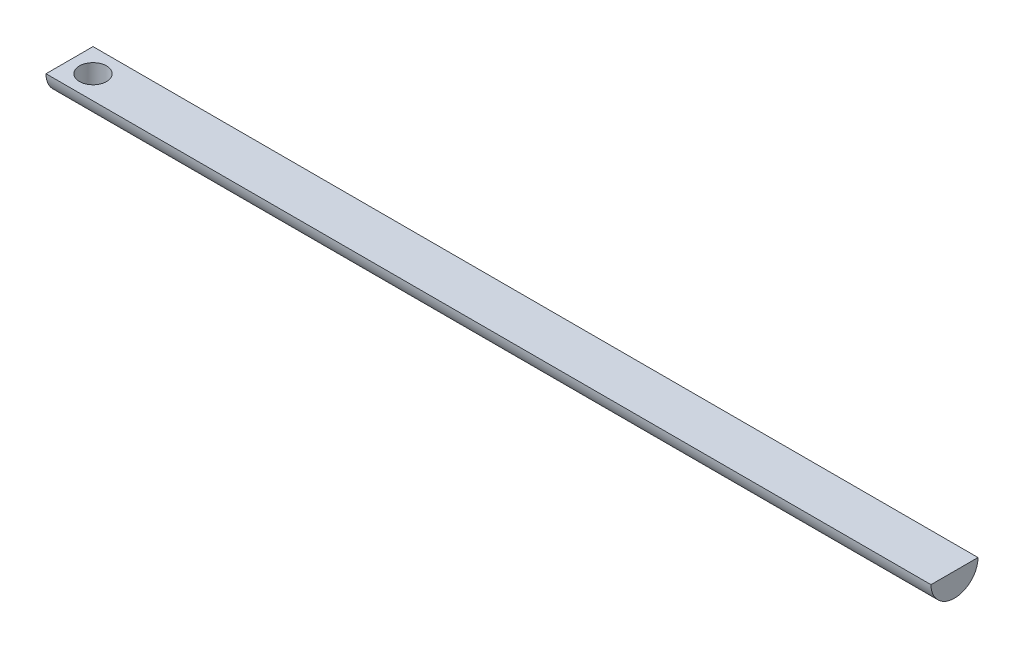
ISO-10303-21;
HEADER;
FILE_DESCRIPTION(('STEP AP214'),'2;1');
FILE_NAME('part.step','',(''),(''),'','','');
FILE_SCHEMA(('AUTOMOTIVE_DESIGN { 1 0 10303 214 1 1 1 1 }'));
ENDSEC;
DATA;
#1=APPLICATION_CONTEXT('core data for automotive mechanical design processes');
#2=APPLICATION_PROTOCOL_DEFINITION('international standard','automotive_design',2000,#1);
#3=PRODUCT_CONTEXT('',#1,'mechanical');
#4=PRODUCT('Part','Part','',(#3));
#5=PRODUCT_RELATED_PRODUCT_CATEGORY('part','',(#4));
#6=PRODUCT_DEFINITION_FORMATION('','',#4);
#7=PRODUCT_DEFINITION_CONTEXT('part definition',#1,'design');
#8=PRODUCT_DEFINITION('design','',#6,#7);
#9=PRODUCT_DEFINITION_SHAPE('','',#8);
#10=(LENGTH_UNIT() NAMED_UNIT(*) SI_UNIT(.MILLI.,.METRE.));
#11=(NAMED_UNIT(*) PLANE_ANGLE_UNIT() SI_UNIT($,.RADIAN.));
#12=(NAMED_UNIT(*) SI_UNIT($,.STERADIAN.) SOLID_ANGLE_UNIT());
#13=UNCERTAINTY_MEASURE_WITH_UNIT(LENGTH_MEASURE(1.E-05),#10,'distance_accuracy_value','');
#14=(GEOMETRIC_REPRESENTATION_CONTEXT(3) GLOBAL_UNCERTAINTY_ASSIGNED_CONTEXT((#13)) GLOBAL_UNIT_ASSIGNED_CONTEXT((#10,
#11,#12)) REPRESENTATION_CONTEXT('',''));
#15=CARTESIAN_POINT('',(0.,0.,0.));
#16=DIRECTION('',(0.,0.,1.));
#17=DIRECTION('',(1.,0.,0.));
#18=AXIS2_PLACEMENT_3D('',#15,#16,#17);
#19=CARTESIAN_POINT('',(-19.238381132,0.,0.));
#20=DIRECTION('',(1.,0.,0.));
#21=DIRECTION('',(0.,0.,-1.));
#22=AXIS2_PLACEMENT_3D('',#19,#20,#21);
#23=CYLINDRICAL_SURFACE('',#22,4.7625);
#24=CARTESIAN_POINT('',(-14.475881132,-3.88830377542702,2.74999999999999));
#25=CARTESIAN_POINT('',(-14.6154852221818,-3.88830587930621,2.74999883491765));
#26=CARTESIAN_POINT('',(-14.7550981181335,-3.89593553817568,2.73930328145687));
#27=CARTESIAN_POINT('',(-15.0297115035431,-3.92516366481732,2.69724269783794));
#28=CARTESIAN_POINT('',(-15.1647070213616,-3.94677671942619,2.66585608306648));
#29=CARTESIAN_POINT('',(-15.4255726669989,-4.00057279944975,2.58440687577187));
#30=CARTESIAN_POINT('',(-15.5514968357306,-4.03268557392372,2.53446811641262));
#31=CARTESIAN_POINT('',(-15.7931222615094,-4.10373801422,2.41772697161589));
#32=CARTESIAN_POINT('',(-15.9088202124561,-4.14267987580842,2.35091915919961));
#33=CARTESIAN_POINT('',(-16.1409812303454,-4.22830198118876,2.19356917077883));
#34=CARTESIAN_POINT('',(-16.2560705852671,-4.27536011683003,2.10120397361381));
#35=CARTESIAN_POINT('',(-16.4702385259634,-4.36887662962746,1.89914552907905));
#36=CARTESIAN_POINT('',(-16.5693063670097,-4.41533458522114,1.78944074972566));
#37=CARTESIAN_POINT('',(-16.7582082713967,-4.50782478633834,1.54267346427661));
#38=CARTESIAN_POINT('',(-16.8461999823735,-4.55337378606475,1.40398639918465));
#39=CARTESIAN_POINT('',(-16.9592221605744,-4.6135550954253,1.18420123561663));
#40=CARTESIAN_POINT('',(-16.9937434034422,-4.63226322507906,1.10895422091026));
#41=CARTESIAN_POINT('',(-17.0560544367173,-4.66642441041304,0.955030585725459));
#42=CARTESIAN_POINT('',(-17.0838485093342,-4.68187953598587,0.876356184805018));
#43=CARTESIAN_POINT('',(-17.1301287006608,-4.70782373993134,0.723377898041835));
#44=CARTESIAN_POINT('',(-17.1492248504899,-4.71863328044411,0.649312172313138));
#45=CARTESIAN_POINT('',(-17.1812250624901,-4.73683634436756,0.499478138293475));
#46=CARTESIAN_POINT('',(-17.1941324701455,-4.74423171331641,0.423710773110705));
#47=CARTESIAN_POINT('',(-17.2135625125591,-4.7553907443262,0.271126024753998));
#48=CARTESIAN_POINT('',(-17.220088140592,-4.75915610897265,0.194309150995613));
#49=CARTESIAN_POINT('',(-17.2266666973281,-4.76295334149383,0.0403323004068748));
#50=CARTESIAN_POINT('',(-17.2267202145561,-4.76298554883365,-0.0368276445890793));
#51=CARTESIAN_POINT('',(-17.2178726372451,-4.75787491203964,-0.249998217036768));
#52=CARTESIAN_POINT('',(-17.2020646344675,-4.74873967198016,-0.385707258622333));
#53=CARTESIAN_POINT('',(-17.1509038451293,-4.7195576187624,-0.652065078438339));
#54=CARTESIAN_POINT('',(-17.1155496183596,-4.69951000155756,-0.782713483030643));
#55=CARTESIAN_POINT('',(-17.0264837690719,-4.65006428065995,-1.03692573802871));
#56=CARTESIAN_POINT('',(-16.9726224156077,-4.62059005044247,-1.16042189033012));
#57=CARTESIAN_POINT('',(-16.8484883110455,-4.55471263964845,-1.39681207693103));
#58=CARTESIAN_POINT('',(-16.7782108377461,-4.51830746590027,-1.50970304745582));
#59=CARTESIAN_POINT('',(-16.6141301339464,-4.43681969268294,-1.73552260390604));
#60=CARTESIAN_POINT('',(-16.5185549721156,-4.3912208279119,-1.84697690002465));
#61=CARTESIAN_POINT('',(-16.3111881147554,-4.29867907131808,-2.05318525118317));
#62=CARTESIAN_POINT('',(-16.1993762627988,-4.25173456800803,-2.14791821947782));
#63=CARTESIAN_POINT('',(-15.9489792252352,-4.15622004509959,-2.32779633395073));
#64=CARTESIAN_POINT('',(-15.8088226608791,-4.10798049681462,-2.41094939984701));
#65=CARTESIAN_POINT('',(-15.5134574240803,-4.02190136968189,-2.55197772374603));
#66=CARTESIAN_POINT('',(-15.3582763380942,-3.9840432018418,-2.60989827429046));
#67=CARTESIAN_POINT('',(-15.0744587543764,-3.93224111198343,-2.68710233091371));
#68=CARTESIAN_POINT('',(-14.9480557095074,-3.91478131505084,-2.7122422187777));
#69=CARTESIAN_POINT('',(-14.6919326437156,-3.89222067204206,-2.7445283395405));
#70=CARTESIAN_POINT('',(-14.5622160675986,-3.88710747954931,-2.75169254812574));
#71=CARTESIAN_POINT('',(-14.3031354014722,-3.88998013731096,-2.74762860941465));
#72=CARTESIAN_POINT('',(-14.1737716427324,-3.89797566913988,-2.73638686823525));
#73=CARTESIAN_POINT('',(-13.9191427201924,-3.92591368648854,-2.69614295857265));
#74=CARTESIAN_POINT('',(-13.7938806721784,-3.94586504171942,-2.66712760395747));
#75=CARTESIAN_POINT('',(-13.5491480736175,-3.99539722331328,-2.592337995176));
#76=CARTESIAN_POINT('',(-13.4297474625128,-4.02507179046594,-2.54640003293607));
#77=CARTESIAN_POINT('',(-13.1998911766549,-4.09083130922471,-2.43935386081035));
#78=CARTESIAN_POINT('',(-13.089439117637,-4.12691883341612,-2.37823955894608));
#79=CARTESIAN_POINT('',(-12.8608166880978,-4.20881052895718,-2.23060065383238));
#80=CARTESIAN_POINT('',(-12.7445071491199,-4.25522522604444,-2.14152550302251));
#81=CARTESIAN_POINT('',(-12.5273814426932,-4.34809362555827,-1.94608135483644));
#82=CARTESIAN_POINT('',(-12.4265786961404,-4.39454732717359,-1.83969753908343));
#83=CARTESIAN_POINT('',(-12.2326232341287,-4.48811131263387,-1.59892892533195));
#84=CARTESIAN_POINT('',(-12.1414085035419,-4.5347709939573,-1.46277239593626));
#85=CARTESIAN_POINT('',(-12.0231767182355,-4.59712540728279,-1.24640402136017));
#86=CARTESIAN_POINT('',(-11.9868552099948,-4.61664309589095,-1.17223134459331));
#87=CARTESIAN_POINT('',(-11.9208199500919,-4.65257692081205,-1.02029808614337));
#88=CARTESIAN_POINT('',(-11.8911020743726,-4.66899499190861,-0.942539780584442));
#89=CARTESIAN_POINT('',(-11.8407793366156,-4.6970488835675,-0.790344366637079));
#90=CARTESIAN_POINT('',(-11.8196375341274,-4.7089612654446,-0.716135253136256));
#91=CARTESIAN_POINT('',(-11.7836049808688,-4.72938014106823,-0.565791615885945));
#92=CARTESIAN_POINT('',(-11.7687108391042,-4.73788848228332,-0.489658160451029));
#93=CARTESIAN_POINT('',(-11.7453969775974,-4.75124798516582,-0.336122755159983));
#94=CARTESIAN_POINT('',(-11.7369738368962,-4.75610107918935,-0.258721497675619));
#95=CARTESIAN_POINT('',(-11.7267202185895,-4.76201415757879,-0.103365973151112));
#96=CARTESIAN_POINT('',(-11.7248890573859,-4.76307453525489,-0.0254117642929458));
#97=CARTESIAN_POINT('',(-11.7290074139458,-4.76069188609969,0.189466487735567));
#98=CARTESIAN_POINT('',(-11.7419076220403,-4.75322555124408,0.326295404143724));
#99=CARTESIAN_POINT('',(-11.7876286698824,-4.72707821467467,0.595369129229569));
#100=CARTESIAN_POINT('',(-11.8204504110033,-4.70839670551758,0.727613730198305));
#101=CARTESIAN_POINT('',(-11.9044384126064,-4.66154624791974,0.984050398516189));
#102=CARTESIAN_POINT('',(-11.9555726515451,-4.63339386558524,1.10825607800419));
#103=CARTESIAN_POINT('',(-12.0743586998122,-4.56986884587246,1.34644970472317));
#104=CARTESIAN_POINT('',(-12.142014833413,-4.5344943186416,1.46043496627067));
#105=CARTESIAN_POINT('',(-12.3003213375925,-4.4549715024455,1.6884197508144));
#106=CARTESIAN_POINT('',(-12.392681917932,-4.410286194789,1.80104321758976));
#107=CARTESIAN_POINT('',(-12.5935794383751,-4.31902205245674,2.01009868725515));
#108=CARTESIAN_POINT('',(-12.7021355964385,-4.27244101668878,2.10651116080856));
#109=CARTESIAN_POINT('',(-12.9464110680375,-4.17662509357829,2.29110411776497));
#110=CARTESIAN_POINT('',(-13.0838029893327,-4.12765781140798,2.37722841876759));
#111=CARTESIAN_POINT('',(-13.3739704910884,-4.03907989072813,2.52481403197027));
#112=CARTESIAN_POINT('',(-13.5267235007934,-3.99945580229541,2.58631088665692));
#113=CARTESIAN_POINT('',(-13.8118973779203,-3.94263859757724,2.67190995943804));
#114=CARTESIAN_POINT('',(-13.9422197990667,-3.92253552622089,2.70104822057837));
#115=CARTESIAN_POINT('',(-14.2069890289663,-3.89537448036743,2.74008291836056));
#116=CARTESIAN_POINT('',(-14.3414309966919,-3.88830174921961,2.7500011220694));
#117=CARTESIAN_POINT('',(-14.475881132,-3.88830377542702,2.74999999999999));
#118=B_SPLINE_CURVE_WITH_KNOTS('',3,(#24,#25,#26,#27,#28,#29,#30,#31,#32,#33,#34,#35,#36,#37,
#38,#39,#40,#41,#42,#43,#44,#45,#46,#47,#48,#49,#50,#51,#52,#53,#54,#55,#56,#57,#58,#59,#60,#61,
#62,#63,#64,#65,#66,#67,#68,#69,#70,#71,#72,#73,#74,#75,#76,#77,#78,#79,#80,#81,#82,#83,#84,#85,
#86,#87,#88,#89,#90,#91,#92,#93,#94,#95,#96,#97,#98,#99,#100,#101,#102,#103,#104,#105,#106,#107,
#108,#109,#110,#111,#112,#113,#114,#115,#116,#117),.UNSPECIFIED.,.T.,.F.,(4,2,2,2,2,2,2,2,2,2,2,
2,2,2,2,2,2,2,2,2,2,2,2,2,2,2,2,2,2,2,2,2,2,2,2,2,2,2,2,2,2,2,2,2,2,2,4),(0.,0.418249565803552,
0.836936135352352,1.25287682136757,1.66895149141453,2.13176015789124,2.59487792841622,
3.10315447239935,3.35745703679342,3.61159729551518,3.84301505571462,4.07430757562723,
4.30549155926143,4.53665452075717,4.94530460916895,5.35398481184235,5.76605246339868,
6.17823879512822,6.63759758991315,7.09753159222605,7.60483109270739,8.11121619685135,
8.49968312922574,8.88776143941098,9.27612649770404,9.6647800311379,10.0572965749503,
10.4499709353828,10.9091476918833,11.3687196497721,11.876918474382,12.1311929929367,
12.3853082645447,12.6192051339033,12.8529748880897,13.0866209723657,13.3202428265009,
13.7309681121824,14.1417119829965,14.5517410992021,14.9618776474886,15.4171030794834,
15.872873050902,16.3785307259256,16.8834559796423,17.2867214279916,17.6895299033135),.UNSPECIFIED.);
#119=CARTESIAN_POINT('',(-14.475881132,-3.88830377542702,2.74999999999999));
#120=VERTEX_POINT('',#119);
#121=EDGE_CURVE('E42',#120,#120,#118,.T.);
#122=ORIENTED_EDGE('',*,*,#121,.F.);
#123=EDGE_LOOP('',(#122));
#124=FACE_BOUND('',#123,.T.);
#125=DIRECTION('',(1.,0.,0.));
#126=VECTOR('',#125,1.);
#127=CARTESIAN_POINT('',(-19.238381132,0.,-4.7625));
#128=LINE('',#127,#126);
#129=CARTESIAN_POINT('',(-19.238381132,0.,-4.7625));
#130=VERTEX_POINT('',#129);
#131=CARTESIAN_POINT('',(160.,0.,-4.7625));
#132=VERTEX_POINT('',#131);
#133=EDGE_CURVE('E51',#130,#132,#128,.T.);
#134=ORIENTED_EDGE('',*,*,#133,.T.);
#135=CARTESIAN_POINT('',(160.,0.,0.));
#136=DIRECTION('',(1.,0.,0.));
#137=DIRECTION('',(0.,0.,-1.));
#138=AXIS2_PLACEMENT_3D('',#135,#136,#137);
#139=CIRCLE('',#138,4.7625);
#140=CARTESIAN_POINT('',(160.,0.,4.7625));
#141=VERTEX_POINT('',#140);
#142=EDGE_CURVE('E69',#141,#132,#139,.T.);
#143=ORIENTED_EDGE('',*,*,#142,.F.);
#144=DIRECTION('',(1.,0.,0.));
#145=VECTOR('',#144,1.);
#146=CARTESIAN_POINT('',(-19.238381132,0.,4.7625));
#147=LINE('',#146,#145);
#148=CARTESIAN_POINT('',(-19.238381132,0.,4.7625));
#149=VERTEX_POINT('',#148);
#150=EDGE_CURVE('E11',#149,#141,#147,.T.);
#151=ORIENTED_EDGE('',*,*,#150,.F.);
#152=CARTESIAN_POINT('',(-19.238381132,0.,0.));
#153=DIRECTION('',(1.,0.,0.));
#154=DIRECTION('',(0.,0.,-1.));
#155=AXIS2_PLACEMENT_3D('',#152,#153,#154);
#156=CIRCLE('',#155,4.7625);
#157=EDGE_CURVE('E70',#149,#130,#156,.T.);
#158=ORIENTED_EDGE('',*,*,#157,.T.);
#159=EDGE_LOOP('',(#134,#143,#151,#158));
#160=FACE_BOUND('',#159,.T.);
#161=ADVANCED_FACE('F38',(#124,#160),#23,.T.);
#162=CARTESIAN_POINT('',(-19.238381132,0.,4.7625));
#163=DIRECTION('',(0.,1.,0.));
#164=DIRECTION('',(0.,0.,1.));
#165=AXIS2_PLACEMENT_3D('',#162,#163,#164);
#166=PLANE('',#165);
#167=CARTESIAN_POINT('',(-14.475881132,0.,0.));
#168=DIRECTION('',(0.,1.,0.));
#169=DIRECTION('',(0.,0.,1.));
#170=AXIS2_PLACEMENT_3D('',#167,#168,#169);
#171=CIRCLE('',#170,2.74999999999999);
#172=CARTESIAN_POINT('',(-14.475881132,0.,2.74999999999999));
#173=VERTEX_POINT('',#172);
#174=EDGE_CURVE('E81',#173,#173,#171,.T.);
#175=ORIENTED_EDGE('',*,*,#174,.F.);
#176=EDGE_LOOP('',(#175));
#177=FACE_BOUND('',#176,.T.);
#178=ORIENTED_EDGE('',*,*,#150,.T.);
#179=DIRECTION('',(0.,0.,1.));
#180=VECTOR('',#179,1.);
#181=CARTESIAN_POINT('',(160.,0.,4.7625));
#182=LINE('',#181,#180);
#183=EDGE_CURVE('E74',#132,#141,#182,.T.);
#184=ORIENTED_EDGE('',*,*,#183,.F.);
#185=ORIENTED_EDGE('',*,*,#133,.F.);
#186=DIRECTION('',(0.,0.,1.));
#187=VECTOR('',#186,1.);
#188=CARTESIAN_POINT('',(-19.238381132,0.,4.7625));
#189=LINE('',#188,#187);
#190=EDGE_CURVE('E72',#130,#149,#189,.T.);
#191=ORIENTED_EDGE('',*,*,#190,.T.);
#192=EDGE_LOOP('',(#178,#184,#185,#191));
#193=FACE_BOUND('',#192,.T.);
#194=ADVANCED_FACE('F75',(#177,#193),#166,.T.);
#195=CARTESIAN_POINT('',(-19.238381132,0.,0.));
#196=DIRECTION('',(1.,0.,0.));
#197=DIRECTION('',(0.,0.,-1.));
#198=AXIS2_PLACEMENT_3D('',#195,#196,#197);
#199=PLANE('',#198);
#200=ORIENTED_EDGE('',*,*,#157,.F.);
#201=ORIENTED_EDGE('',*,*,#190,.F.);
#202=EDGE_LOOP('',(#200,#201));
#203=FACE_BOUND('',#202,.T.);
#204=ADVANCED_FACE('F86',(#203),#199,.F.);
#205=CARTESIAN_POINT('',(160.,0.,0.));
#206=DIRECTION('',(1.,0.,0.));
#207=DIRECTION('',(0.,0.,-1.));
#208=AXIS2_PLACEMENT_3D('',#205,#206,#207);
#209=PLANE('',#208);
#210=ORIENTED_EDGE('',*,*,#142,.T.);
#211=ORIENTED_EDGE('',*,*,#183,.T.);
#212=EDGE_LOOP('',(#210,#211));
#213=FACE_BOUND('',#212,.T.);
#214=ADVANCED_FACE('F78',(#213),#209,.T.);
#215=CARTESIAN_POINT('',(-14.475881132,0.,0.));
#216=DIRECTION('',(0.,1.,0.));
#217=DIRECTION('',(0.,0.,1.));
#218=AXIS2_PLACEMENT_3D('',#215,#216,#217);
#219=CYLINDRICAL_SURFACE('',#218,2.74999999999999);
#220=ORIENTED_EDGE('',*,*,#121,.T.);
#221=EDGE_LOOP('',(#220));
#222=FACE_BOUND('',#221,.T.);
#223=ORIENTED_EDGE('',*,*,#174,.T.);
#224=EDGE_LOOP('',(#223));
#225=FACE_BOUND('',#224,.T.);
#226=ADVANCED_FACE('F93',(#222,#225),#219,.F.);
#227=CLOSED_SHELL('',(#161,#194,#204,#214,#226));
#228=MANIFOLD_SOLID_BREP('B2',#227);
#229=ADVANCED_BREP_SHAPE_REPRESENTATION('',(#18,#228),#14);
#230=SHAPE_DEFINITION_REPRESENTATION(#9,#229);
ENDSEC;
END-ISO-10303-21;
